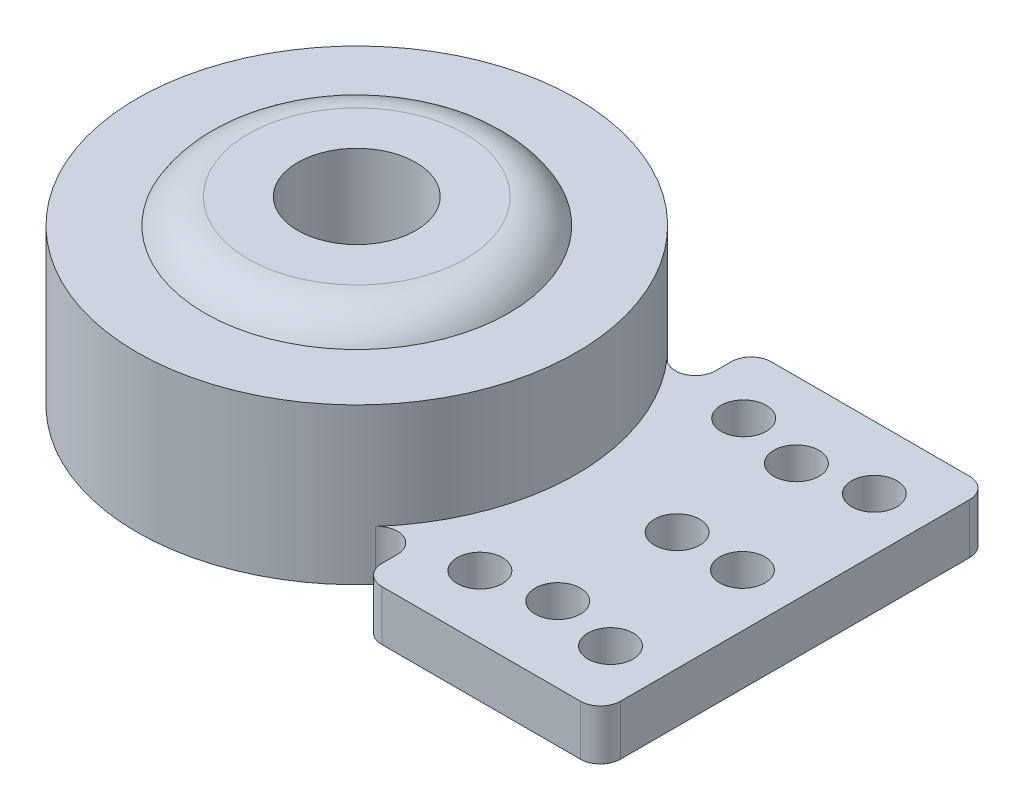
ISO-10303-21;
HEADER;
FILE_DESCRIPTION(('STEP AP214'),'2;1');
FILE_NAME('part.step','',(''),(''),'','','');
FILE_SCHEMA(('AUTOMOTIVE_DESIGN { 1 0 10303 214 1 1 1 1 }'));
ENDSEC;
DATA;
#1=APPLICATION_CONTEXT('core data for automotive mechanical design processes');
#2=APPLICATION_PROTOCOL_DEFINITION('international standard','automotive_design',2000,#1);
#3=PRODUCT_CONTEXT('',#1,'mechanical');
#4=PRODUCT('Part','Part','',(#3));
#5=PRODUCT_RELATED_PRODUCT_CATEGORY('part','',(#4));
#6=PRODUCT_DEFINITION_FORMATION('','',#4);
#7=PRODUCT_DEFINITION_CONTEXT('part definition',#1,'design');
#8=PRODUCT_DEFINITION('design','',#6,#7);
#9=PRODUCT_DEFINITION_SHAPE('','',#8);
#10=(LENGTH_UNIT() NAMED_UNIT(*) SI_UNIT(.MILLI.,.METRE.));
#11=(NAMED_UNIT(*) PLANE_ANGLE_UNIT() SI_UNIT($,.RADIAN.));
#12=(NAMED_UNIT(*) SI_UNIT($,.STERADIAN.) SOLID_ANGLE_UNIT());
#13=UNCERTAINTY_MEASURE_WITH_UNIT(LENGTH_MEASURE(1.E-05),#10,'distance_accuracy_value','');
#14=(GEOMETRIC_REPRESENTATION_CONTEXT(3) GLOBAL_UNCERTAINTY_ASSIGNED_CONTEXT((#13)) GLOBAL_UNIT_ASSIGNED_CONTEXT((#10,
#11,#12)) REPRESENTATION_CONTEXT('',''));
#15=CARTESIAN_POINT('',(0.,0.,0.));
#16=DIRECTION('',(0.,0.,1.));
#17=DIRECTION('',(1.,0.,0.));
#18=AXIS2_PLACEMENT_3D('',#15,#16,#17);
#19=CARTESIAN_POINT('',(0.,0.,0.));
#20=DIRECTION('',(0.,1.,0.));
#21=DIRECTION('',(0.,0.,1.));
#22=AXIS2_PLACEMENT_3D('',#19,#20,#21);
#23=PLANE('',#22);
#24=CARTESIAN_POINT('',(12.75,0.,0.));
#25=DIRECTION('',(0.,-1.,0.));
#26=DIRECTION('',(0.,0.,-1.));
#27=AXIS2_PLACEMENT_3D('',#24,#25,#26);
#28=CIRCLE('',#27,0.9);
#29=CARTESIAN_POINT('',(12.75,0.,-0.9));
#30=VERTEX_POINT('',#29);
#31=EDGE_CURVE('E596',#30,#30,#28,.T.);
#32=ORIENTED_EDGE('',*,*,#31,.F.);
#33=EDGE_LOOP('',(#32));
#34=FACE_BOUND('',#33,.T.);
#35=CARTESIAN_POINT('',(15.35,0.,0.));
#36=DIRECTION('',(0.,-1.,0.));
#37=DIRECTION('',(0.,0.,-1.));
#38=AXIS2_PLACEMENT_3D('',#35,#36,#37);
#39=CIRCLE('',#38,0.899999999999999);
#40=CARTESIAN_POINT('',(15.35,0.,-0.899999999999999));
#41=VERTEX_POINT('',#40);
#42=EDGE_CURVE('E586',#41,#41,#39,.T.);
#43=ORIENTED_EDGE('',*,*,#42,.F.);
#44=EDGE_LOOP('',(#43));
#45=FACE_BOUND('',#44,.T.);
#46=CARTESIAN_POINT('',(15.35,0.,-5.25));
#47=DIRECTION('',(0.,-1.,0.));
#48=DIRECTION('',(0.,0.,-1.));
#49=AXIS2_PLACEMENT_3D('',#46,#47,#48);
#50=CIRCLE('',#49,0.899999999999999);
#51=CARTESIAN_POINT('',(15.35,0.,-6.15));
#52=VERTEX_POINT('',#51);
#53=EDGE_CURVE('E592',#52,#52,#50,.T.);
#54=ORIENTED_EDGE('',*,*,#53,.F.);
#55=EDGE_LOOP('',(#54));
#56=FACE_BOUND('',#55,.T.);
#57=CARTESIAN_POINT('',(12.75,0.,-4.75));
#58=DIRECTION('',(0.,-1.,0.));
#59=DIRECTION('',(0.,0.,-1.));
#60=AXIS2_PLACEMENT_3D('',#57,#58,#59);
#61=CIRCLE('',#60,0.9);
#62=CARTESIAN_POINT('',(12.75,0.,-5.65));
#63=VERTEX_POINT('',#62);
#64=EDGE_CURVE('E627',#63,#63,#61,.T.);
#65=ORIENTED_EDGE('',*,*,#64,.F.);
#66=EDGE_LOOP('',(#65));
#67=FACE_BOUND('',#66,.T.);
#68=CARTESIAN_POINT('',(10.15,0.,-5.25));
#69=DIRECTION('',(0.,-1.,0.));
#70=DIRECTION('',(0.,0.,-1.));
#71=AXIS2_PLACEMENT_3D('',#68,#69,#70);
#72=CIRCLE('',#71,0.9);
#73=CARTESIAN_POINT('',(10.15,0.,-6.15));
#74=VERTEX_POINT('',#73);
#75=EDGE_CURVE('E222',#74,#74,#72,.T.);
#76=ORIENTED_EDGE('',*,*,#75,.F.);
#77=EDGE_LOOP('',(#76));
#78=FACE_BOUND('',#77,.T.);
#79=CARTESIAN_POINT('',(0.,0.,0.));
#80=DIRECTION('',(0.,-1.,0.));
#81=DIRECTION('',(0.,0.,-1.));
#82=AXIS2_PLACEMENT_3D('',#79,#80,#81);
#83=CIRCLE('',#82,4.75);
#84=CARTESIAN_POINT('',(0.,0.,-4.75));
#85=VERTEX_POINT('',#84);
#86=EDGE_CURVE('E216',#85,#85,#83,.T.);
#87=ORIENTED_EDGE('',*,*,#86,.F.);
#88=EDGE_LOOP('',(#87));
#89=FACE_BOUND('',#88,.T.);
#90=DIRECTION('',(0.,0.,1.));
#91=VECTOR('',#90,1.);
#92=CARTESIAN_POINT('',(17.45,0.,0.));
#93=LINE('',#92,#91);
#94=CARTESIAN_POINT('',(17.45,0.,-6.95));
#95=VERTEX_POINT('',#94);
#96=CARTESIAN_POINT('',(17.45,0.,6.95));
#97=VERTEX_POINT('',#96);
#98=EDGE_CURVE('E279',#95,#97,#93,.T.);
#99=ORIENTED_EDGE('',*,*,#98,.T.);
#100=CARTESIAN_POINT('',(16.65,0.,6.95));
#101=DIRECTION('',(0.,1.,0.));
#102=DIRECTION('',(0.,0.,1.));
#103=AXIS2_PLACEMENT_3D('',#100,#101,#102);
#104=CIRCLE('',#103,0.8);
#105=CARTESIAN_POINT('',(16.65,0.,7.75));
#106=VERTEX_POINT('',#105);
#107=EDGE_CURVE('E196',#97,#106,#104,.F.);
#108=ORIENTED_EDGE('',*,*,#107,.T.);
#109=DIRECTION('',(-1.,0.,0.));
#110=VECTOR('',#109,1.);
#111=CARTESIAN_POINT('',(0.,0.,7.75));
#112=LINE('',#111,#110);
#113=CARTESIAN_POINT('',(8.74999999999999,0.,7.75));
#114=VERTEX_POINT('',#113);
#115=EDGE_CURVE('E264',#106,#114,#112,.T.);
#116=ORIENTED_EDGE('',*,*,#115,.T.);
#117=CARTESIAN_POINT('',(8.74999999999999,0.,6.95));
#118=DIRECTION('',(0.,1.,0.));
#119=DIRECTION('',(0.,0.,1.));
#120=AXIS2_PLACEMENT_3D('',#117,#118,#119);
#121=CIRCLE('',#120,0.8);
#122=CARTESIAN_POINT('',(7.94999999999999,0.,6.95));
#123=VERTEX_POINT('',#122);
#124=EDGE_CURVE('E194',#114,#123,#121,.F.);
#125=ORIENTED_EDGE('',*,*,#124,.T.);
#126=DIRECTION('',(0.,0.,1.));
#127=VECTOR('',#126,1.);
#128=CARTESIAN_POINT('',(7.94999999999999,0.,0.));
#129=LINE('',#128,#127);
#130=CARTESIAN_POINT('',(7.94999999999999,0.,6.33087671653778));
#131=VERTEX_POINT('',#130);
#132=EDGE_CURVE('E258',#131,#123,#129,.T.);
#133=ORIENTED_EDGE('',*,*,#132,.F.);
#134=CARTESIAN_POINT('',(7.14999999999999,0.,6.33087671653778));
#135=DIRECTION('',(0.,1.,0.));
#136=DIRECTION('',(0.,0.,1.));
#137=AXIS2_PLACEMENT_3D('',#134,#135,#136);
#138=CIRCLE('',#137,0.8);
#139=CARTESIAN_POINT('',(6.55104712041884,0.,5.80054149421001));
#140=VERTEX_POINT('',#139);
#141=EDGE_CURVE('E165',#131,#140,#138,.T.);
#142=ORIENTED_EDGE('',*,*,#141,.T.);
#143=CARTESIAN_POINT('',(0.,0.,0.));
#144=DIRECTION('',(0.,1.,0.));
#145=DIRECTION('',(0.,0.,1.));
#146=AXIS2_PLACEMENT_3D('',#143,#144,#145);
#147=CIRCLE('',#146,8.75);
#148=CARTESIAN_POINT('',(6.55104712041884,0.,-5.80054149421001));
#149=VERTEX_POINT('',#148);
#150=EDGE_CURVE('E155',#149,#140,#147,.T.);
#151=ORIENTED_EDGE('',*,*,#150,.F.);
#152=CARTESIAN_POINT('',(7.14999999999999,0.,-6.33087671653778));
#153=DIRECTION('',(0.,1.,0.));
#154=DIRECTION('',(0.,0.,1.));
#155=AXIS2_PLACEMENT_3D('',#152,#153,#154);
#156=CIRCLE('',#155,0.8);
#157=CARTESIAN_POINT('',(7.94999999999999,0.,-6.33087671653778));
#158=VERTEX_POINT('',#157);
#159=EDGE_CURVE('E138',#149,#158,#156,.T.);
#160=ORIENTED_EDGE('',*,*,#159,.T.);
#161=DIRECTION('',(0.,0.,1.));
#162=VECTOR('',#161,1.);
#163=CARTESIAN_POINT('',(7.94999999999999,0.,0.));
#164=LINE('',#163,#162);
#165=CARTESIAN_POINT('',(7.94999999999999,0.,-6.95));
#166=VERTEX_POINT('',#165);
#167=EDGE_CURVE('E275',#166,#158,#164,.T.);
#168=ORIENTED_EDGE('',*,*,#167,.F.);
#169=CARTESIAN_POINT('',(8.74999999999999,0.,-6.95));
#170=DIRECTION('',(0.,1.,0.));
#171=DIRECTION('',(0.,0.,1.));
#172=AXIS2_PLACEMENT_3D('',#169,#170,#171);
#173=CIRCLE('',#172,0.8);
#174=CARTESIAN_POINT('',(8.74999999999999,0.,-7.75));
#175=VERTEX_POINT('',#174);
#176=EDGE_CURVE('E190',#166,#175,#173,.F.);
#177=ORIENTED_EDGE('',*,*,#176,.T.);
#178=DIRECTION('',(-1.,0.,0.));
#179=VECTOR('',#178,1.);
#180=CARTESIAN_POINT('',(0.,0.,-7.75));
#181=LINE('',#180,#179);
#182=CARTESIAN_POINT('',(16.65,0.,-7.75));
#183=VERTEX_POINT('',#182);
#184=EDGE_CURVE('E277',#183,#175,#181,.T.);
#185=ORIENTED_EDGE('',*,*,#184,.F.);
#186=CARTESIAN_POINT('',(16.65,0.,-6.95));
#187=DIRECTION('',(0.,1.,0.));
#188=DIRECTION('',(0.,0.,1.));
#189=AXIS2_PLACEMENT_3D('',#186,#187,#188);
#190=CIRCLE('',#189,0.8);
#191=EDGE_CURVE('E192',#183,#95,#190,.F.);
#192=ORIENTED_EDGE('',*,*,#191,.T.);
#193=EDGE_LOOP('',(#99,#108,#116,#125,#133,#142,#151,#160,#168,#177,#185,#192));
#194=FACE_BOUND('',#193,.T.);
#195=CARTESIAN_POINT('',(12.75,0.,4.75));
#196=DIRECTION('',(0.,-1.,0.));
#197=DIRECTION('',(0.,0.,-1.));
#198=AXIS2_PLACEMENT_3D('',#195,#196,#197);
#199=CIRCLE('',#198,0.9);
#200=CARTESIAN_POINT('',(12.75,0.,3.85));
#201=VERTEX_POINT('',#200);
#202=EDGE_CURVE('E589',#201,#201,#199,.F.);
#203=ORIENTED_EDGE('',*,*,#202,.T.);
#204=EDGE_LOOP('',(#203));
#205=FACE_BOUND('',#204,.T.);
#206=CARTESIAN_POINT('',(10.15,0.,5.25));
#207=DIRECTION('',(0.,-1.,0.));
#208=DIRECTION('',(0.,0.,-1.));
#209=AXIS2_PLACEMENT_3D('',#206,#207,#208);
#210=CIRCLE('',#209,0.9);
#211=CARTESIAN_POINT('',(10.15,0.,4.35));
#212=VERTEX_POINT('',#211);
#213=EDGE_CURVE('E585',#212,#212,#210,.F.);
#214=ORIENTED_EDGE('',*,*,#213,.T.);
#215=EDGE_LOOP('',(#214));
#216=FACE_BOUND('',#215,.T.);
#217=CARTESIAN_POINT('',(15.35,0.,5.25));
#218=DIRECTION('',(0.,-1.,0.));
#219=DIRECTION('',(0.,0.,-1.));
#220=AXIS2_PLACEMENT_3D('',#217,#218,#219);
#221=CIRCLE('',#220,0.899999999999999);
#222=CARTESIAN_POINT('',(15.35,0.,4.35));
#223=VERTEX_POINT('',#222);
#224=EDGE_CURVE('E583',#223,#223,#221,.F.);
#225=ORIENTED_EDGE('',*,*,#224,.T.);
#226=EDGE_LOOP('',(#225));
#227=FACE_BOUND('',#226,.T.);
#228=ADVANCED_FACE('F45',(#34,#45,#56,#67,#78,#89,#194,#205,#216,#227),#23,.F.);
#229=CARTESIAN_POINT('',(0.,2.,0.));
#230=DIRECTION('',(0.,-1.,0.));
#231=DIRECTION('',(0.,0.,-1.));
#232=AXIS2_PLACEMENT_3D('',#229,#230,#231);
#233=PLANE('',#232);
#234=CARTESIAN_POINT('',(12.75,2.,0.));
#235=DIRECTION('',(0.,-1.,0.));
#236=DIRECTION('',(0.,0.,-1.));
#237=AXIS2_PLACEMENT_3D('',#234,#235,#236);
#238=CIRCLE('',#237,0.9);
#239=CARTESIAN_POINT('',(12.75,2.,-0.9));
#240=VERTEX_POINT('',#239);
#241=EDGE_CURVE('E231',#240,#240,#238,.T.);
#242=ORIENTED_EDGE('',*,*,#241,.T.);
#243=EDGE_LOOP('',(#242));
#244=FACE_BOUND('',#243,.T.);
#245=CARTESIAN_POINT('',(15.35,2.,0.));
#246=DIRECTION('',(0.,-1.,0.));
#247=DIRECTION('',(0.,0.,-1.));
#248=AXIS2_PLACEMENT_3D('',#245,#246,#247);
#249=CIRCLE('',#248,0.899999999999999);
#250=CARTESIAN_POINT('',(15.35,2.,-0.899999999999999));
#251=VERTEX_POINT('',#250);
#252=EDGE_CURVE('E228',#251,#251,#249,.T.);
#253=ORIENTED_EDGE('',*,*,#252,.T.);
#254=EDGE_LOOP('',(#253));
#255=FACE_BOUND('',#254,.T.);
#256=CARTESIAN_POINT('',(15.35,2.,-5.25));
#257=DIRECTION('',(0.,-1.,0.));
#258=DIRECTION('',(0.,0.,-1.));
#259=AXIS2_PLACEMENT_3D('',#256,#257,#258);
#260=CIRCLE('',#259,0.899999999999999);
#261=CARTESIAN_POINT('',(15.35,2.,-6.15));
#262=VERTEX_POINT('',#261);
#263=EDGE_CURVE('E225',#262,#262,#260,.T.);
#264=ORIENTED_EDGE('',*,*,#263,.T.);
#265=EDGE_LOOP('',(#264));
#266=FACE_BOUND('',#265,.T.);
#267=CARTESIAN_POINT('',(12.75,2.,-4.75));
#268=DIRECTION('',(0.,-1.,0.));
#269=DIRECTION('',(0.,0.,-1.));
#270=AXIS2_PLACEMENT_3D('',#267,#268,#269);
#271=CIRCLE('',#270,0.9);
#272=CARTESIAN_POINT('',(12.75,2.,-5.65));
#273=VERTEX_POINT('',#272);
#274=EDGE_CURVE('E221',#273,#273,#271,.T.);
#275=ORIENTED_EDGE('',*,*,#274,.T.);
#276=EDGE_LOOP('',(#275));
#277=FACE_BOUND('',#276,.T.);
#278=CARTESIAN_POINT('',(10.15,2.,-5.25));
#279=DIRECTION('',(0.,-1.,0.));
#280=DIRECTION('',(0.,0.,-1.));
#281=AXIS2_PLACEMENT_3D('',#278,#279,#280);
#282=CIRCLE('',#281,0.9);
#283=CARTESIAN_POINT('',(10.15,2.,-6.15));
#284=VERTEX_POINT('',#283);
#285=EDGE_CURVE('E218',#284,#284,#282,.T.);
#286=ORIENTED_EDGE('',*,*,#285,.T.);
#287=EDGE_LOOP('',(#286));
#288=FACE_BOUND('',#287,.T.);
#289=DIRECTION('',(-1.,0.,0.));
#290=VECTOR('',#289,1.);
#291=CARTESIAN_POINT('',(0.,2.,7.75));
#292=LINE('',#291,#290);
#293=CARTESIAN_POINT('',(16.65,2.,7.75));
#294=VERTEX_POINT('',#293);
#295=CARTESIAN_POINT('',(8.74999999999999,2.,7.75));
#296=VERTEX_POINT('',#295);
#297=EDGE_CURVE('E167',#294,#296,#292,.T.);
#298=ORIENTED_EDGE('',*,*,#297,.F.);
#299=CARTESIAN_POINT('',(16.65,2.,6.95));
#300=DIRECTION('',(0.,-1.,0.));
#301=DIRECTION('',(0.,0.,-1.));
#302=AXIS2_PLACEMENT_3D('',#299,#300,#301);
#303=CIRCLE('',#302,0.8);
#304=CARTESIAN_POINT('',(17.45,2.,6.95));
#305=VERTEX_POINT('',#304);
#306=EDGE_CURVE('E208',#294,#305,#303,.F.);
#307=ORIENTED_EDGE('',*,*,#306,.T.);
#308=DIRECTION('',(0.,0.,1.));
#309=VECTOR('',#308,1.);
#310=CARTESIAN_POINT('',(17.45,2.,0.));
#311=LINE('',#310,#309);
#312=CARTESIAN_POINT('',(17.45,2.,-6.95));
#313=VERTEX_POINT('',#312);
#314=EDGE_CURVE('E172',#313,#305,#311,.T.);
#315=ORIENTED_EDGE('',*,*,#314,.F.);
#316=CARTESIAN_POINT('',(16.65,2.,-6.95));
#317=DIRECTION('',(0.,-1.,0.));
#318=DIRECTION('',(0.,0.,-1.));
#319=AXIS2_PLACEMENT_3D('',#316,#317,#318);
#320=CIRCLE('',#319,0.8);
#321=CARTESIAN_POINT('',(16.65,2.,-7.75));
#322=VERTEX_POINT('',#321);
#323=EDGE_CURVE('E69',#313,#322,#320,.F.);
#324=ORIENTED_EDGE('',*,*,#323,.T.);
#325=DIRECTION('',(-1.,0.,0.));
#326=VECTOR('',#325,1.);
#327=CARTESIAN_POINT('',(0.,2.,-7.75));
#328=LINE('',#327,#326);
#329=CARTESIAN_POINT('',(8.74999999999999,2.,-7.75));
#330=VERTEX_POINT('',#329);
#331=EDGE_CURVE('E269',#322,#330,#328,.T.);
#332=ORIENTED_EDGE('',*,*,#331,.T.);
#333=CARTESIAN_POINT('',(8.74999999999999,2.,-6.95));
#334=DIRECTION('',(0.,-1.,0.));
#335=DIRECTION('',(0.,0.,-1.));
#336=AXIS2_PLACEMENT_3D('',#333,#334,#335);
#337=CIRCLE('',#336,0.8);
#338=CARTESIAN_POINT('',(7.94999999999999,2.,-6.95));
#339=VERTEX_POINT('',#338);
#340=EDGE_CURVE('E203',#330,#339,#337,.F.);
#341=ORIENTED_EDGE('',*,*,#340,.T.);
#342=DIRECTION('',(0.,0.,1.));
#343=VECTOR('',#342,1.);
#344=CARTESIAN_POINT('',(7.94999999999999,2.,0.));
#345=LINE('',#344,#343);
#346=CARTESIAN_POINT('',(7.94999999999999,2.,-6.33087671653778));
#347=VERTEX_POINT('',#346);
#348=EDGE_CURVE('E266',#339,#347,#345,.T.);
#349=ORIENTED_EDGE('',*,*,#348,.T.);
#350=CARTESIAN_POINT('',(7.14999999999999,2.,-6.33087671653778));
#351=DIRECTION('',(0.,-1.,0.));
#352=DIRECTION('',(0.,0.,-1.));
#353=AXIS2_PLACEMENT_3D('',#350,#351,#352);
#354=CIRCLE('',#353,0.8);
#355=CARTESIAN_POINT('',(6.55104712041884,2.,-5.80054149421001));
#356=VERTEX_POINT('',#355);
#357=EDGE_CURVE('E148',#347,#356,#354,.T.);
#358=ORIENTED_EDGE('',*,*,#357,.T.);
#359=CARTESIAN_POINT('',(0.,2.,0.));
#360=DIRECTION('',(0.,-1.,0.));
#361=DIRECTION('',(0.,0.,-1.));
#362=AXIS2_PLACEMENT_3D('',#359,#360,#361);
#363=CIRCLE('',#362,8.75);
#364=CARTESIAN_POINT('',(6.55104712041884,2.,5.80054149421001));
#365=VERTEX_POINT('',#364);
#366=EDGE_CURVE('E157',#356,#365,#363,.T.);
#367=ORIENTED_EDGE('',*,*,#366,.T.);
#368=CARTESIAN_POINT('',(7.14999999999999,2.,6.33087671653778));
#369=DIRECTION('',(0.,-1.,0.));
#370=DIRECTION('',(0.,0.,-1.));
#371=AXIS2_PLACEMENT_3D('',#368,#369,#370);
#372=CIRCLE('',#371,0.8);
#373=CARTESIAN_POINT('',(7.94999999999999,2.,6.33087671653778));
#374=VERTEX_POINT('',#373);
#375=EDGE_CURVE('E215',#365,#374,#372,.T.);
#376=ORIENTED_EDGE('',*,*,#375,.T.);
#377=DIRECTION('',(0.,0.,1.));
#378=VECTOR('',#377,1.);
#379=CARTESIAN_POINT('',(7.94999999999999,2.,0.));
#380=LINE('',#379,#378);
#381=CARTESIAN_POINT('',(7.94999999999999,2.,6.95));
#382=VERTEX_POINT('',#381);
#383=EDGE_CURVE('E261',#374,#382,#380,.T.);
#384=ORIENTED_EDGE('',*,*,#383,.T.);
#385=CARTESIAN_POINT('',(8.74999999999999,2.,6.95));
#386=DIRECTION('',(0.,-1.,0.));
#387=DIRECTION('',(0.,0.,-1.));
#388=AXIS2_PLACEMENT_3D('',#385,#386,#387);
#389=CIRCLE('',#388,0.8);
#390=EDGE_CURVE('E206',#382,#296,#389,.F.);
#391=ORIENTED_EDGE('',*,*,#390,.T.);
#392=EDGE_LOOP('',(#298,#307,#315,#324,#332,#341,#349,#358,#367,#376,#384,#391));
#393=FACE_BOUND('',#392,.T.);
#394=CARTESIAN_POINT('',(12.75,2.,4.75));
#395=DIRECTION('',(0.,-1.,0.));
#396=DIRECTION('',(0.,0.,-1.));
#397=AXIS2_PLACEMENT_3D('',#394,#395,#396);
#398=CIRCLE('',#397,0.9);
#399=CARTESIAN_POINT('',(12.75,2.,3.85));
#400=VERTEX_POINT('',#399);
#401=EDGE_CURVE('E234',#400,#400,#398,.F.);
#402=ORIENTED_EDGE('',*,*,#401,.F.);
#403=EDGE_LOOP('',(#402));
#404=FACE_BOUND('',#403,.T.);
#405=CARTESIAN_POINT('',(10.15,2.,5.25));
#406=DIRECTION('',(0.,-1.,0.));
#407=DIRECTION('',(0.,0.,-1.));
#408=AXIS2_PLACEMENT_3D('',#405,#406,#407);
#409=CIRCLE('',#408,0.9);
#410=CARTESIAN_POINT('',(10.15,2.,4.35));
#411=VERTEX_POINT('',#410);
#412=EDGE_CURVE('E236',#411,#411,#409,.F.);
#413=ORIENTED_EDGE('',*,*,#412,.F.);
#414=EDGE_LOOP('',(#413));
#415=FACE_BOUND('',#414,.T.);
#416=CARTESIAN_POINT('',(15.35,2.,5.25));
#417=DIRECTION('',(0.,-1.,0.));
#418=DIRECTION('',(0.,0.,-1.));
#419=AXIS2_PLACEMENT_3D('',#416,#417,#418);
#420=CIRCLE('',#419,0.899999999999999);
#421=CARTESIAN_POINT('',(15.35,2.,4.35));
#422=VERTEX_POINT('',#421);
#423=EDGE_CURVE('E49',#422,#422,#420,.F.);
#424=ORIENTED_EDGE('',*,*,#423,.F.);
#425=EDGE_LOOP('',(#424));
#426=FACE_BOUND('',#425,.T.);
#427=ADVANCED_FACE('F291',(#244,#255,#266,#277,#288,#393,#404,#415,#426),#233,.F.);
#428=CARTESIAN_POINT('',(0.,6.2,0.));
#429=DIRECTION('',(0.,-1.,0.));
#430=DIRECTION('',(0.,0.,-1.));
#431=AXIS2_PLACEMENT_3D('',#428,#429,#430);
#432=CYLINDRICAL_SURFACE('',#431,8.75);
#433=CARTESIAN_POINT('',(0.,6.2,0.));
#434=DIRECTION('',(0.,1.,0.));
#435=DIRECTION('',(0.,0.,1.));
#436=AXIS2_PLACEMENT_3D('',#433,#434,#435);
#437=CIRCLE('',#436,8.75);
#438=CARTESIAN_POINT('',(0.,6.2,8.75));
#439=VERTEX_POINT('',#438);
#440=EDGE_CURVE('E166',#439,#439,#437,.T.);
#441=ORIENTED_EDGE('',*,*,#440,.F.);
#442=EDGE_LOOP('',(#441));
#443=FACE_BOUND('',#442,.T.);
#444=ORIENTED_EDGE('',*,*,#366,.F.);
#445=DIRECTION('',(0.,-1.,0.));
#446=VECTOR('',#445,1.);
#447=CARTESIAN_POINT('',(6.55104712041884,6.2,-5.80054149421001));
#448=LINE('',#447,#446);
#449=EDGE_CURVE('E142',#356,#149,#448,.T.);
#450=ORIENTED_EDGE('',*,*,#449,.T.);
#451=ORIENTED_EDGE('',*,*,#150,.T.);
#452=DIRECTION('',(0.,-1.,0.));
#453=VECTOR('',#452,1.);
#454=CARTESIAN_POINT('',(6.55104712041884,6.2,5.80054149421001));
#455=LINE('',#454,#453);
#456=EDGE_CURVE('E160',#140,#365,#455,.F.);
#457=ORIENTED_EDGE('',*,*,#456,.T.);
#458=EDGE_LOOP('',(#444,#450,#451,#457));
#459=FACE_BOUND('',#458,.T.);
#460=ADVANCED_FACE('F153',(#443,#459),#432,.T.);
#461=CARTESIAN_POINT('',(0.,6.2,0.));
#462=DIRECTION('',(0.,1.,0.));
#463=DIRECTION('',(0.,0.,1.));
#464=AXIS2_PLACEMENT_3D('',#461,#462,#463);
#465=PLANE('',#464);
#466=CARTESIAN_POINT('',(0.,6.2,0.));
#467=DIRECTION('',(0.,1.,0.));
#468=DIRECTION('',(0.,0.,1.));
#469=AXIS2_PLACEMENT_3D('',#466,#467,#468);
#470=CIRCLE('',#469,6.05);
#471=CARTESIAN_POINT('',(0.,6.2,6.05));
#472=VERTEX_POINT('',#471);
#473=EDGE_CURVE('E54',#472,#472,#470,.T.);
#474=ORIENTED_EDGE('',*,*,#473,.F.);
#475=EDGE_LOOP('',(#474));
#476=FACE_BOUND('',#475,.T.);
#477=ORIENTED_EDGE('',*,*,#440,.T.);
#478=EDGE_LOOP('',(#477));
#479=FACE_BOUND('',#478,.T.);
#480=ADVANCED_FACE('F340',(#476,#479),#465,.T.);
#481=CARTESIAN_POINT('',(7.94999999999999,2.,0.));
#482=DIRECTION('',(1.,0.,0.));
#483=DIRECTION('',(0.,0.,-1.));
#484=AXIS2_PLACEMENT_3D('',#481,#482,#483);
#485=PLANE('',#484);
#486=ORIENTED_EDGE('',*,*,#383,.F.);
#487=DIRECTION('',(0.,1.,0.));
#488=VECTOR('',#487,1.);
#489=CARTESIAN_POINT('',(7.94999999999999,0.,6.33087671653778));
#490=LINE('',#489,#488);
#491=EDGE_CURVE('E182',#374,#131,#490,.F.);
#492=ORIENTED_EDGE('',*,*,#491,.T.);
#493=ORIENTED_EDGE('',*,*,#132,.T.);
#494=DIRECTION('',(0.,-1.,0.));
#495=VECTOR('',#494,1.);
#496=CARTESIAN_POINT('',(7.94999999999999,2.,6.95));
#497=LINE('',#496,#495);
#498=EDGE_CURVE('E180',#123,#382,#497,.F.);
#499=ORIENTED_EDGE('',*,*,#498,.T.);
#500=EDGE_LOOP('',(#486,#492,#493,#499));
#501=FACE_BOUND('',#500,.T.);
#502=ADVANCED_FACE('F315',(#501),#485,.F.);
#503=CARTESIAN_POINT('',(0.,2.,7.75));
#504=DIRECTION('',(0.,0.,1.));
#505=DIRECTION('',(1.,0.,0.));
#506=AXIS2_PLACEMENT_3D('',#503,#504,#505);
#507=PLANE('',#506);
#508=ORIENTED_EDGE('',*,*,#115,.F.);
#509=DIRECTION('',(0.,-1.,0.));
#510=VECTOR('',#509,1.);
#511=CARTESIAN_POINT('',(16.65,2.,7.75));
#512=LINE('',#511,#510);
#513=EDGE_CURVE('E201',#106,#294,#512,.F.);
#514=ORIENTED_EDGE('',*,*,#513,.T.);
#515=ORIENTED_EDGE('',*,*,#297,.T.);
#516=DIRECTION('',(0.,-1.,0.));
#517=VECTOR('',#516,1.);
#518=CARTESIAN_POINT('',(8.74999999999999,0.,7.75));
#519=LINE('',#518,#517);
#520=EDGE_CURVE('E198',#296,#114,#519,.T.);
#521=ORIENTED_EDGE('',*,*,#520,.T.);
#522=EDGE_LOOP('',(#508,#514,#515,#521));
#523=FACE_BOUND('',#522,.T.);
#524=ADVANCED_FACE('F284',(#523),#507,.T.);
#525=CARTESIAN_POINT('',(17.45,2.,0.));
#526=DIRECTION('',(1.,0.,0.));
#527=DIRECTION('',(0.,0.,-1.));
#528=AXIS2_PLACEMENT_3D('',#525,#526,#527);
#529=PLANE('',#528);
#530=ORIENTED_EDGE('',*,*,#314,.T.);
#531=DIRECTION('',(0.,-1.,0.));
#532=VECTOR('',#531,1.);
#533=CARTESIAN_POINT('',(17.45,2.,6.95));
#534=LINE('',#533,#532);
#535=EDGE_CURVE('E187',#305,#97,#534,.T.);
#536=ORIENTED_EDGE('',*,*,#535,.T.);
#537=ORIENTED_EDGE('',*,*,#98,.F.);
#538=DIRECTION('',(0.,-1.,0.));
#539=VECTOR('',#538,1.);
#540=CARTESIAN_POINT('',(17.45,2.,-6.95));
#541=LINE('',#540,#539);
#542=EDGE_CURVE('E185',#95,#313,#541,.F.);
#543=ORIENTED_EDGE('',*,*,#542,.T.);
#544=EDGE_LOOP('',(#530,#536,#537,#543));
#545=FACE_BOUND('',#544,.T.);
#546=ADVANCED_FACE('F294',(#545),#529,.T.);
#547=CARTESIAN_POINT('',(0.,2.,-7.75));
#548=DIRECTION('',(0.,0.,1.));
#549=DIRECTION('',(1.,0.,0.));
#550=AXIS2_PLACEMENT_3D('',#547,#548,#549);
#551=PLANE('',#550);
#552=ORIENTED_EDGE('',*,*,#331,.F.);
#553=DIRECTION('',(0.,-1.,0.));
#554=VECTOR('',#553,1.);
#555=CARTESIAN_POINT('',(16.65,0.,-7.75));
#556=LINE('',#555,#554);
#557=EDGE_CURVE('E149',#322,#183,#556,.T.);
#558=ORIENTED_EDGE('',*,*,#557,.T.);
#559=ORIENTED_EDGE('',*,*,#184,.T.);
#560=DIRECTION('',(0.,-1.,0.));
#561=VECTOR('',#560,1.);
#562=CARTESIAN_POINT('',(8.74999999999999,2.,-7.75));
#563=LINE('',#562,#561);
#564=EDGE_CURVE('E62',#175,#330,#563,.F.);
#565=ORIENTED_EDGE('',*,*,#564,.T.);
#566=EDGE_LOOP('',(#552,#558,#559,#565));
#567=FACE_BOUND('',#566,.T.);
#568=ADVANCED_FACE('F301',(#567),#551,.F.);
#569=CARTESIAN_POINT('',(7.94999999999999,2.,0.));
#570=DIRECTION('',(1.,0.,0.));
#571=DIRECTION('',(0.,0.,-1.));
#572=AXIS2_PLACEMENT_3D('',#569,#570,#571);
#573=PLANE('',#572);
#574=ORIENTED_EDGE('',*,*,#167,.T.);
#575=DIRECTION('',(0.,1.,0.));
#576=VECTOR('',#575,1.);
#577=CARTESIAN_POINT('',(7.94999999999999,2.,-6.33087671653778));
#578=LINE('',#577,#576);
#579=EDGE_CURVE('E143',#158,#347,#578,.T.);
#580=ORIENTED_EDGE('',*,*,#579,.T.);
#581=ORIENTED_EDGE('',*,*,#348,.F.);
#582=DIRECTION('',(0.,-1.,0.));
#583=VECTOR('',#582,1.);
#584=CARTESIAN_POINT('',(7.94999999999999,2.,-6.95));
#585=LINE('',#584,#583);
#586=EDGE_CURVE('E159',#339,#166,#585,.T.);
#587=ORIENTED_EDGE('',*,*,#586,.T.);
#588=EDGE_LOOP('',(#574,#580,#581,#587));
#589=FACE_BOUND('',#588,.T.);
#590=ADVANCED_FACE('F308',(#589),#573,.F.);
#591=CARTESIAN_POINT('',(7.14999999999999,6.2,-6.33087671653778));
#592=DIRECTION('',(0.,-1.,0.));
#593=DIRECTION('',(0.,0.,-1.));
#594=AXIS2_PLACEMENT_3D('',#591,#592,#593);
#595=CYLINDRICAL_SURFACE('',#594,0.8);
#596=ORIENTED_EDGE('',*,*,#357,.F.);
#597=ORIENTED_EDGE('',*,*,#579,.F.);
#598=ORIENTED_EDGE('',*,*,#159,.F.);
#599=ORIENTED_EDGE('',*,*,#449,.F.);
#600=EDGE_LOOP('',(#596,#597,#598,#599));
#601=FACE_BOUND('',#600,.T.);
#602=ADVANCED_FACE('F141',(#601),#595,.F.);
#603=CARTESIAN_POINT('',(7.14999999999999,6.2,6.33087671653778));
#604=DIRECTION('',(0.,-1.,0.));
#605=DIRECTION('',(0.,0.,-1.));
#606=AXIS2_PLACEMENT_3D('',#603,#604,#605);
#607=CYLINDRICAL_SURFACE('',#606,0.8);
#608=ORIENTED_EDGE('',*,*,#375,.F.);
#609=ORIENTED_EDGE('',*,*,#456,.F.);
#610=ORIENTED_EDGE('',*,*,#141,.F.);
#611=ORIENTED_EDGE('',*,*,#491,.F.);
#612=EDGE_LOOP('',(#608,#609,#610,#611));
#613=FACE_BOUND('',#612,.T.);
#614=ADVANCED_FACE('F313',(#613),#607,.F.);
#615=CARTESIAN_POINT('',(16.65,2.,6.95));
#616=DIRECTION('',(0.,-1.,0.));
#617=DIRECTION('',(0.,0.,-1.));
#618=AXIS2_PLACEMENT_3D('',#615,#616,#617);
#619=CYLINDRICAL_SURFACE('',#618,0.8);
#620=ORIENTED_EDGE('',*,*,#306,.F.);
#621=ORIENTED_EDGE('',*,*,#513,.F.);
#622=ORIENTED_EDGE('',*,*,#107,.F.);
#623=ORIENTED_EDGE('',*,*,#535,.F.);
#624=EDGE_LOOP('',(#620,#621,#622,#623));
#625=FACE_BOUND('',#624,.T.);
#626=ADVANCED_FACE('F289',(#625),#619,.T.);
#627=CARTESIAN_POINT('',(8.74999999999999,2.,6.95));
#628=DIRECTION('',(0.,1.,0.));
#629=DIRECTION('',(0.,0.,1.));
#630=AXIS2_PLACEMENT_3D('',#627,#628,#629);
#631=CYLINDRICAL_SURFACE('',#630,0.8);
#632=ORIENTED_EDGE('',*,*,#390,.F.);
#633=ORIENTED_EDGE('',*,*,#498,.F.);
#634=ORIENTED_EDGE('',*,*,#124,.F.);
#635=ORIENTED_EDGE('',*,*,#520,.F.);
#636=EDGE_LOOP('',(#632,#633,#634,#635));
#637=FACE_BOUND('',#636,.T.);
#638=ADVANCED_FACE('F319',(#637),#631,.T.);
#639=CARTESIAN_POINT('',(16.65,2.,-6.95));
#640=DIRECTION('',(0.,1.,0.));
#641=DIRECTION('',(0.,0.,1.));
#642=AXIS2_PLACEMENT_3D('',#639,#640,#641);
#643=CYLINDRICAL_SURFACE('',#642,0.8);
#644=ORIENTED_EDGE('',*,*,#323,.F.);
#645=ORIENTED_EDGE('',*,*,#542,.F.);
#646=ORIENTED_EDGE('',*,*,#191,.F.);
#647=ORIENTED_EDGE('',*,*,#557,.F.);
#648=EDGE_LOOP('',(#644,#645,#646,#647));
#649=FACE_BOUND('',#648,.T.);
#650=ADVANCED_FACE('F298',(#649),#643,.T.);
#651=CARTESIAN_POINT('',(8.74999999999999,2.,-6.95));
#652=DIRECTION('',(0.,-1.,0.));
#653=DIRECTION('',(0.,0.,-1.));
#654=AXIS2_PLACEMENT_3D('',#651,#652,#653);
#655=CYLINDRICAL_SURFACE('',#654,0.8);
#656=ORIENTED_EDGE('',*,*,#340,.F.);
#657=ORIENTED_EDGE('',*,*,#564,.F.);
#658=ORIENTED_EDGE('',*,*,#176,.F.);
#659=ORIENTED_EDGE('',*,*,#586,.F.);
#660=EDGE_LOOP('',(#656,#657,#658,#659));
#661=FACE_BOUND('',#660,.T.);
#662=ADVANCED_FACE('F305',(#661),#655,.T.);
#663=CARTESIAN_POINT('',(0.,-1.3,0.));
#664=DIRECTION('',(0.,1.,0.));
#665=DIRECTION('',(0.,0.,1.));
#666=AXIS2_PLACEMENT_3D('',#663,#664,#665);
#667=CYLINDRICAL_SURFACE('',#666,4.75);
#668=CARTESIAN_POINT('',(0.,-1.3,0.));
#669=DIRECTION('',(0.,-1.,0.));
#670=DIRECTION('',(0.,0.,-1.));
#671=AXIS2_PLACEMENT_3D('',#668,#669,#670);
#672=CIRCLE('',#671,4.75);
#673=CARTESIAN_POINT('',(0.,-1.3,-4.75));
#674=VERTEX_POINT('',#673);
#675=EDGE_CURVE('E250',#674,#674,#672,.T.);
#676=ORIENTED_EDGE('',*,*,#675,.F.);
#677=EDGE_LOOP('',(#676));
#678=FACE_BOUND('',#677,.T.);
#679=ORIENTED_EDGE('',*,*,#86,.T.);
#680=EDGE_LOOP('',(#679));
#681=FACE_BOUND('',#680,.T.);
#682=ADVANCED_FACE('F376',(#678,#681),#667,.T.);
#683=CARTESIAN_POINT('',(0.,-1.3,0.));
#684=DIRECTION('',(0.,-1.,0.));
#685=DIRECTION('',(0.,0.,-1.));
#686=AXIS2_PLACEMENT_3D('',#683,#684,#685);
#687=PLANE('',#686);
#688=CARTESIAN_POINT('',(0.,-1.3,0.));
#689=DIRECTION('',(0.,-1.,0.));
#690=DIRECTION('',(0.,0.,-1.));
#691=AXIS2_PLACEMENT_3D('',#688,#689,#690);
#692=CIRCLE('',#691,2.35);
#693=CARTESIAN_POINT('',(0.,-1.3,-2.35));
#694=VERTEX_POINT('',#693);
#695=EDGE_CURVE('E241',#694,#694,#692,.T.);
#696=ORIENTED_EDGE('',*,*,#695,.F.);
#697=EDGE_LOOP('',(#696));
#698=FACE_BOUND('',#697,.T.);
#699=ORIENTED_EDGE('',*,*,#675,.T.);
#700=EDGE_LOOP('',(#699));
#701=FACE_BOUND('',#700,.T.);
#702=ADVANCED_FACE('F384',(#698,#701),#687,.T.);
#703=CARTESIAN_POINT('',(0.,7.2,0.));
#704=DIRECTION('',(0.,1.,0.));
#705=DIRECTION('',(0.,0.,1.));
#706=AXIS2_PLACEMENT_3D('',#703,#704,#705);
#707=PLANE('',#706);
#708=CARTESIAN_POINT('',(0.,7.2,0.));
#709=DIRECTION('',(0.,1.,0.));
#710=DIRECTION('',(0.,0.,1.));
#711=AXIS2_PLACEMENT_3D('',#708,#709,#710);
#712=CIRCLE('',#711,4.31794919243112);
#713=CARTESIAN_POINT('',(0.,7.2,4.31794919243112));
#714=VERTEX_POINT('',#713);
#715=EDGE_CURVE('E12',#714,#714,#712,.T.);
#716=ORIENTED_EDGE('',*,*,#715,.T.);
#717=EDGE_LOOP('',(#716));
#718=FACE_BOUND('',#717,.T.);
#719=CARTESIAN_POINT('',(0.,7.2,0.));
#720=DIRECTION('',(0.,-1.,0.));
#721=DIRECTION('',(0.,0.,-1.));
#722=AXIS2_PLACEMENT_3D('',#719,#720,#721);
#723=CIRCLE('',#722,2.35);
#724=CARTESIAN_POINT('',(0.,7.2,-2.35));
#725=VERTEX_POINT('',#724);
#726=EDGE_CURVE('E245',#725,#725,#723,.T.);
#727=ORIENTED_EDGE('',*,*,#726,.T.);
#728=EDGE_LOOP('',(#727));
#729=FACE_BOUND('',#728,.T.);
#730=ADVANCED_FACE('F404',(#718,#729),#707,.T.);
#731=CARTESIAN_POINT('',(0.,7.2,0.));
#732=DIRECTION('',(0.,-1.,0.));
#733=DIRECTION('',(0.,0.,-1.));
#734=AXIS2_PLACEMENT_3D('',#731,#732,#733);
#735=CYLINDRICAL_SURFACE('',#734,2.35);
#736=ORIENTED_EDGE('',*,*,#726,.F.);
#737=EDGE_LOOP('',(#736));
#738=FACE_BOUND('',#737,.T.);
#739=ORIENTED_EDGE('',*,*,#695,.T.);
#740=EDGE_LOOP('',(#739));
#741=FACE_BOUND('',#740,.T.);
#742=ADVANCED_FACE('F412',(#738,#741),#735,.F.);
#743=CARTESIAN_POINT('',(0.,5.2,0.));
#744=DIRECTION('',(0.,-1.,0.));
#745=DIRECTION('',(0.,0.,-1.));
#746=AXIS2_PLACEMENT_3D('',#743,#744,#745);
#747=TOROIDAL_SURFACE('',#746,4.31794919243112,2.);
#748=ORIENTED_EDGE('',*,*,#473,.T.);
#749=EDGE_LOOP('',(#748));
#750=FACE_BOUND('',#749,.T.);
#751=ORIENTED_EDGE('',*,*,#715,.F.);
#752=EDGE_LOOP('',(#751));
#753=FACE_BOUND('',#752,.T.);
#754=ADVANCED_FACE('F47',(#750,#753),#747,.T.);
#755=CARTESIAN_POINT('',(10.15,10.,-5.25));
#756=DIRECTION('',(0.,-1.,0.));
#757=DIRECTION('',(0.,0.,-1.));
#758=AXIS2_PLACEMENT_3D('',#755,#756,#757);
#759=CYLINDRICAL_SURFACE('',#758,0.9);
#760=ORIENTED_EDGE('',*,*,#75,.T.);
#761=EDGE_LOOP('',(#760));
#762=FACE_BOUND('',#761,.T.);
#763=ORIENTED_EDGE('',*,*,#285,.F.);
#764=EDGE_LOOP('',(#763));
#765=FACE_BOUND('',#764,.T.);
#766=ADVANCED_FACE('F432',(#762,#765),#759,.F.);
#767=CARTESIAN_POINT('',(12.75,10.,-4.75));
#768=DIRECTION('',(0.,-1.,0.));
#769=DIRECTION('',(0.,0.,-1.));
#770=AXIS2_PLACEMENT_3D('',#767,#768,#769);
#771=CYLINDRICAL_SURFACE('',#770,0.9);
#772=ORIENTED_EDGE('',*,*,#64,.T.);
#773=EDGE_LOOP('',(#772));
#774=FACE_BOUND('',#773,.T.);
#775=ORIENTED_EDGE('',*,*,#274,.F.);
#776=EDGE_LOOP('',(#775));
#777=FACE_BOUND('',#776,.T.);
#778=ADVANCED_FACE('F455',(#774,#777),#771,.F.);
#779=CARTESIAN_POINT('',(15.35,10.,-5.25));
#780=DIRECTION('',(0.,-1.,0.));
#781=DIRECTION('',(0.,0.,-1.));
#782=AXIS2_PLACEMENT_3D('',#779,#780,#781);
#783=CYLINDRICAL_SURFACE('',#782,0.899999999999999);
#784=ORIENTED_EDGE('',*,*,#53,.T.);
#785=EDGE_LOOP('',(#784));
#786=FACE_BOUND('',#785,.T.);
#787=ORIENTED_EDGE('',*,*,#263,.F.);
#788=EDGE_LOOP('',(#787));
#789=FACE_BOUND('',#788,.T.);
#790=ADVANCED_FACE('F466',(#786,#789),#783,.F.);
#791=CARTESIAN_POINT('',(15.35,10.,0.));
#792=DIRECTION('',(0.,-1.,0.));
#793=DIRECTION('',(0.,0.,-1.));
#794=AXIS2_PLACEMENT_3D('',#791,#792,#793);
#795=CYLINDRICAL_SURFACE('',#794,0.899999999999999);
#796=ORIENTED_EDGE('',*,*,#42,.T.);
#797=EDGE_LOOP('',(#796));
#798=FACE_BOUND('',#797,.T.);
#799=ORIENTED_EDGE('',*,*,#252,.F.);
#800=EDGE_LOOP('',(#799));
#801=FACE_BOUND('',#800,.T.);
#802=ADVANCED_FACE('F476',(#798,#801),#795,.F.);
#803=CARTESIAN_POINT('',(12.75,10.,0.));
#804=DIRECTION('',(0.,-1.,0.));
#805=DIRECTION('',(0.,0.,-1.));
#806=AXIS2_PLACEMENT_3D('',#803,#804,#805);
#807=CYLINDRICAL_SURFACE('',#806,0.9);
#808=ORIENTED_EDGE('',*,*,#31,.T.);
#809=EDGE_LOOP('',(#808));
#810=FACE_BOUND('',#809,.T.);
#811=ORIENTED_EDGE('',*,*,#241,.F.);
#812=EDGE_LOOP('',(#811));
#813=FACE_BOUND('',#812,.T.);
#814=ADVANCED_FACE('F486',(#810,#813),#807,.F.);
#815=CARTESIAN_POINT('',(12.75,10.,4.75));
#816=DIRECTION('',(0.,-1.,0.));
#817=DIRECTION('',(0.,0.,-1.));
#818=AXIS2_PLACEMENT_3D('',#815,#816,#817);
#819=CYLINDRICAL_SURFACE('',#818,0.9);
#820=ORIENTED_EDGE('',*,*,#202,.F.);
#821=EDGE_LOOP('',(#820));
#822=FACE_BOUND('',#821,.T.);
#823=ORIENTED_EDGE('',*,*,#401,.T.);
#824=EDGE_LOOP('',(#823));
#825=FACE_BOUND('',#824,.T.);
#826=ADVANCED_FACE('F496',(#822,#825),#819,.F.);
#827=CARTESIAN_POINT('',(10.15,10.,5.25));
#828=DIRECTION('',(0.,-1.,0.));
#829=DIRECTION('',(0.,0.,-1.));
#830=AXIS2_PLACEMENT_3D('',#827,#828,#829);
#831=CYLINDRICAL_SURFACE('',#830,0.9);
#832=ORIENTED_EDGE('',*,*,#213,.F.);
#833=EDGE_LOOP('',(#832));
#834=FACE_BOUND('',#833,.T.);
#835=ORIENTED_EDGE('',*,*,#412,.T.);
#836=EDGE_LOOP('',(#835));
#837=FACE_BOUND('',#836,.T.);
#838=ADVANCED_FACE('F506',(#834,#837),#831,.F.);
#839=CARTESIAN_POINT('',(15.35,10.,5.25));
#840=DIRECTION('',(0.,-1.,0.));
#841=DIRECTION('',(0.,0.,-1.));
#842=AXIS2_PLACEMENT_3D('',#839,#840,#841);
#843=CYLINDRICAL_SURFACE('',#842,0.899999999999999);
#844=ORIENTED_EDGE('',*,*,#224,.F.);
#845=EDGE_LOOP('',(#844));
#846=FACE_BOUND('',#845,.T.);
#847=ORIENTED_EDGE('',*,*,#423,.T.);
#848=EDGE_LOOP('',(#847));
#849=FACE_BOUND('',#848,.T.);
#850=ADVANCED_FACE('F516',(#846,#849),#843,.F.);
#851=CLOSED_SHELL('',(#228,#427,#460,#480,#502,#524,#546,#568,#590,#602,#614,#626,#638,#650,
#662,#682,#702,#730,#742,#754,#766,#778,#790,#802,#814,#826,#838,#850));
#852=MANIFOLD_SOLID_BREP('B2',#851);
#853=ADVANCED_BREP_SHAPE_REPRESENTATION('',(#18,#852),#14);
#854=SHAPE_DEFINITION_REPRESENTATION(#9,#853);
ENDSEC;
END-ISO-10303-21;
